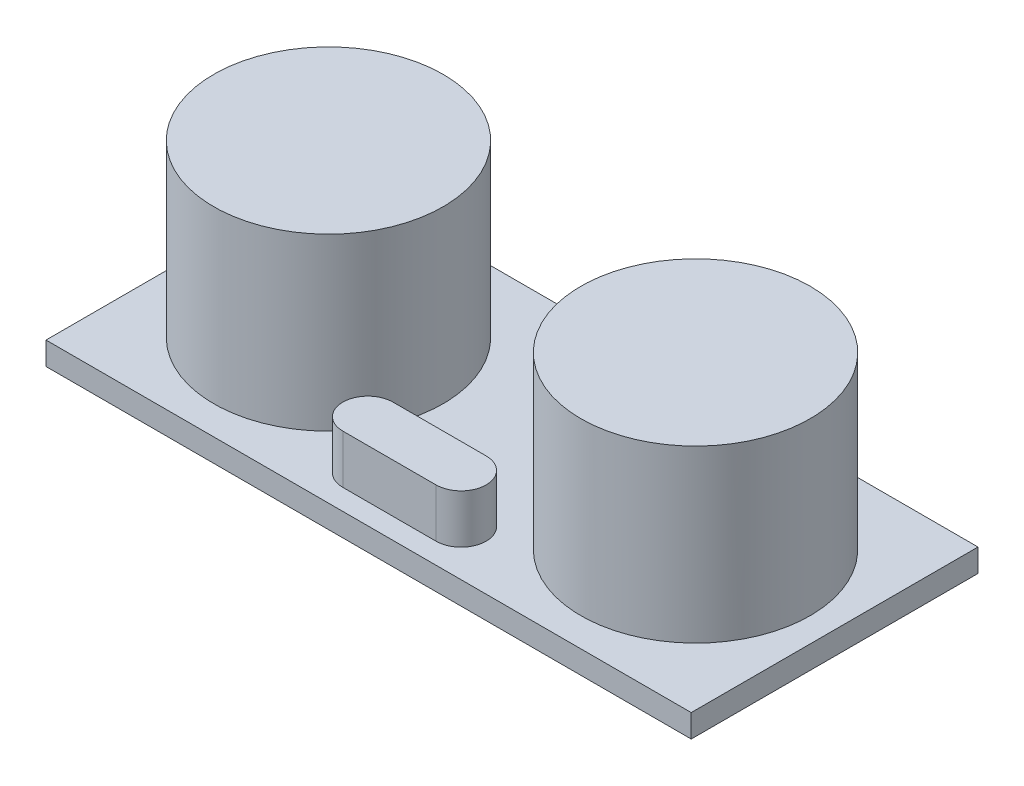
ISO-10303-21;
HEADER;
FILE_DESCRIPTION(('STEP AP214'),'2;1');
FILE_NAME('part.step','',(''),(''),'','','');
FILE_SCHEMA(('AUTOMOTIVE_DESIGN { 1 0 10303 214 1 1 1 1 }'));
ENDSEC;
DATA;
#1=APPLICATION_CONTEXT('core data for automotive mechanical design processes');
#2=APPLICATION_PROTOCOL_DEFINITION('international standard','automotive_design',2000,#1);
#3=PRODUCT_CONTEXT('',#1,'mechanical');
#4=PRODUCT('Part','Part','',(#3));
#5=PRODUCT_RELATED_PRODUCT_CATEGORY('part','',(#4));
#6=PRODUCT_DEFINITION_FORMATION('','',#4);
#7=PRODUCT_DEFINITION_CONTEXT('part definition',#1,'design');
#8=PRODUCT_DEFINITION('design','',#6,#7);
#9=PRODUCT_DEFINITION_SHAPE('','',#8);
#10=(LENGTH_UNIT() NAMED_UNIT(*) SI_UNIT(.MILLI.,.METRE.));
#11=(NAMED_UNIT(*) PLANE_ANGLE_UNIT() SI_UNIT($,.RADIAN.));
#12=(NAMED_UNIT(*) SI_UNIT($,.STERADIAN.) SOLID_ANGLE_UNIT());
#13=UNCERTAINTY_MEASURE_WITH_UNIT(LENGTH_MEASURE(1.E-05),#10,'distance_accuracy_value','');
#14=(GEOMETRIC_REPRESENTATION_CONTEXT(3) GLOBAL_UNCERTAINTY_ASSIGNED_CONTEXT((#13)) GLOBAL_UNIT_ASSIGNED_CONTEXT((#10,
#11,#12)) REPRESENTATION_CONTEXT('',''));
#15=CARTESIAN_POINT('',(0.,0.,0.));
#16=DIRECTION('',(0.,0.,1.));
#17=DIRECTION('',(1.,0.,0.));
#18=AXIS2_PLACEMENT_3D('',#15,#16,#17);
#19=CARTESIAN_POINT('',(0.,1.6,0.));
#20=DIRECTION('',(0.,-1.,0.));
#21=DIRECTION('',(0.,0.,-1.));
#22=AXIS2_PLACEMENT_3D('',#19,#20,#21);
#23=PLANE('',#22);
#24=DIRECTION('',(0.,0.,-1.));
#25=VECTOR('',#24,1.);
#26=CARTESIAN_POINT('',(22.5,1.6,10.));
#27=LINE('',#26,#25);
#28=CARTESIAN_POINT('',(22.5,1.6,10.));
#29=VERTEX_POINT('',#28);
#30=CARTESIAN_POINT('',(22.5,1.6,-10.));
#31=VERTEX_POINT('',#30);
#32=EDGE_CURVE('E214',#29,#31,#27,.T.);
#33=ORIENTED_EDGE('',*,*,#32,.T.);
#34=DIRECTION('',(-1.,0.,0.));
#35=VECTOR('',#34,1.);
#36=CARTESIAN_POINT('',(-22.5,1.6,-10.));
#37=LINE('',#36,#35);
#38=CARTESIAN_POINT('',(-22.5,1.6,-10.));
#39=VERTEX_POINT('',#38);
#40=EDGE_CURVE('E218',#31,#39,#37,.T.);
#41=ORIENTED_EDGE('',*,*,#40,.T.);
#42=DIRECTION('',(0.,0.,1.));
#43=VECTOR('',#42,1.);
#44=CARTESIAN_POINT('',(-22.5,1.6,10.));
#45=LINE('',#44,#43);
#46=CARTESIAN_POINT('',(-22.5,1.6,10.));
#47=VERTEX_POINT('',#46);
#48=EDGE_CURVE('E222',#39,#47,#45,.T.);
#49=ORIENTED_EDGE('',*,*,#48,.T.);
#50=DIRECTION('',(1.,0.,0.));
#51=VECTOR('',#50,1.);
#52=CARTESIAN_POINT('',(-22.5,1.6,10.));
#53=LINE('',#52,#51);
#54=EDGE_CURVE('E225',#47,#29,#53,.T.);
#55=ORIENTED_EDGE('',*,*,#54,.T.);
#56=EDGE_LOOP('',(#33,#41,#49,#55));
#57=FACE_BOUND('',#56,.T.);
#58=CARTESIAN_POINT('',(12.8,1.6,0.));
#59=DIRECTION('',(0.,-1.,0.));
#60=DIRECTION('',(0.,0.,-1.));
#61=AXIS2_PLACEMENT_3D('',#58,#59,#60);
#62=CIRCLE('',#61,8.);
#63=CARTESIAN_POINT('',(12.8,1.6,-8.00000000000001));
#64=VERTEX_POINT('',#63);
#65=EDGE_CURVE('E48',#64,#64,#62,.F.);
#66=ORIENTED_EDGE('',*,*,#65,.F.);
#67=EDGE_LOOP('',(#66));
#68=FACE_BOUND('',#67,.T.);
#69=CARTESIAN_POINT('',(-12.8,1.6,0.));
#70=DIRECTION('',(0.,-1.,0.));
#71=DIRECTION('',(0.,0.,-1.));
#72=AXIS2_PLACEMENT_3D('',#69,#70,#71);
#73=CIRCLE('',#72,8.);
#74=CARTESIAN_POINT('',(-12.8,1.6,-8.));
#75=VERTEX_POINT('',#74);
#76=EDGE_CURVE('E11',#75,#75,#73,.F.);
#77=ORIENTED_EDGE('',*,*,#76,.F.);
#78=EDGE_LOOP('',(#77));
#79=FACE_BOUND('',#78,.T.);
#80=CARTESIAN_POINT('',(-3.24999999999999,1.6,6.79875461617037));
#81=DIRECTION('',(0.,1.,0.));
#82=DIRECTION('',(0.,0.,1.));
#83=AXIS2_PLACEMENT_3D('',#80,#81,#82);
#84=CIRCLE('',#83,1.75);
#85=CARTESIAN_POINT('',(-3.24999999999999,1.6,5.04875461617037));
#86=VERTEX_POINT('',#85);
#87=CARTESIAN_POINT('',(-3.24999999999999,1.6,8.54875461617037));
#88=VERTEX_POINT('',#87);
#89=EDGE_CURVE('E154',#86,#88,#84,.T.);
#90=ORIENTED_EDGE('',*,*,#89,.F.);
#91=DIRECTION('',(-1.,0.,0.));
#92=VECTOR('',#91,1.);
#93=CARTESIAN_POINT('',(-3.24999999999999,1.6,5.04875461617037));
#94=LINE('',#93,#92);
#95=CARTESIAN_POINT('',(3.25000000000001,1.6,5.04875461617037));
#96=VERTEX_POINT('',#95);
#97=EDGE_CURVE('E170',#96,#86,#94,.T.);
#98=ORIENTED_EDGE('',*,*,#97,.F.);
#99=CARTESIAN_POINT('',(3.25,1.6,6.79875461617037));
#100=DIRECTION('',(0.,1.,0.));
#101=DIRECTION('',(0.,0.,1.));
#102=AXIS2_PLACEMENT_3D('',#99,#100,#101);
#103=CIRCLE('',#102,1.75);
#104=CARTESIAN_POINT('',(3.25,1.6,8.54875461617037));
#105=VERTEX_POINT('',#104);
#106=EDGE_CURVE('E183',#105,#96,#103,.T.);
#107=ORIENTED_EDGE('',*,*,#106,.F.);
#108=DIRECTION('',(1.,0.,0.));
#109=VECTOR('',#108,1.);
#110=CARTESIAN_POINT('',(-3.24999999999999,1.6,8.54875461617037));
#111=LINE('',#110,#109);
#112=EDGE_CURVE('E159',#88,#105,#111,.T.);
#113=ORIENTED_EDGE('',*,*,#112,.F.);
#114=EDGE_LOOP('',(#90,#98,#107,#113));
#115=FACE_BOUND('',#114,.T.);
#116=ADVANCED_FACE('F39',(#57,#68,#79,#115),#23,.F.);
#117=CARTESIAN_POINT('',(22.5,1.6,10.));
#118=DIRECTION('',(-1.,0.,0.));
#119=DIRECTION('',(0.,0.,1.));
#120=AXIS2_PLACEMENT_3D('',#117,#118,#119);
#121=PLANE('',#120);
#122=DIRECTION('',(0.,0.,-1.));
#123=VECTOR('',#122,1.);
#124=CARTESIAN_POINT('',(22.5,0.,10.));
#125=LINE('',#124,#123);
#126=CARTESIAN_POINT('',(22.5,0.,10.));
#127=VERTEX_POINT('',#126);
#128=CARTESIAN_POINT('',(22.5,0.,-10.));
#129=VERTEX_POINT('',#128);
#130=EDGE_CURVE('E213',#127,#129,#125,.T.);
#131=ORIENTED_EDGE('',*,*,#130,.T.);
#132=DIRECTION('',(0.,-1.,0.));
#133=VECTOR('',#132,1.);
#134=CARTESIAN_POINT('',(22.5,1.6,-10.));
#135=LINE('',#134,#133);
#136=EDGE_CURVE('E252',#31,#129,#135,.T.);
#137=ORIENTED_EDGE('',*,*,#136,.F.);
#138=ORIENTED_EDGE('',*,*,#32,.F.);
#139=DIRECTION('',(0.,-1.,0.));
#140=VECTOR('',#139,1.);
#141=CARTESIAN_POINT('',(22.5,1.6,10.));
#142=LINE('',#141,#140);
#143=EDGE_CURVE('E228',#29,#127,#142,.T.);
#144=ORIENTED_EDGE('',*,*,#143,.T.);
#145=EDGE_LOOP('',(#131,#137,#138,#144));
#146=FACE_BOUND('',#145,.T.);
#147=ADVANCED_FACE('F41',(#146),#121,.F.);
#148=CARTESIAN_POINT('',(-22.5,1.6,-10.));
#149=DIRECTION('',(0.,0.,1.));
#150=DIRECTION('',(1.,0.,0.));
#151=AXIS2_PLACEMENT_3D('',#148,#149,#150);
#152=PLANE('',#151);
#153=DIRECTION('',(-1.,0.,0.));
#154=VECTOR('',#153,1.);
#155=CARTESIAN_POINT('',(-22.5,0.,-10.));
#156=LINE('',#155,#154);
#157=CARTESIAN_POINT('',(5.,0.,-10.));
#158=VERTEX_POINT('',#157);
#159=EDGE_CURVE('E232',#129,#158,#156,.T.);
#160=ORIENTED_EDGE('',*,*,#159,.T.);
#161=DIRECTION('',(0.,1.,0.));
#162=VECTOR('',#161,1.);
#163=CARTESIAN_POINT('',(5.,-10.,-10.));
#164=LINE('',#163,#162);
#165=CARTESIAN_POINT('',(5.,-10.,-10.));
#166=VERTEX_POINT('',#165);
#167=EDGE_CURVE('E326',#166,#158,#164,.T.);
#168=ORIENTED_EDGE('',*,*,#167,.F.);
#169=DIRECTION('',(1.,0.,0.));
#170=VECTOR('',#169,1.);
#171=CARTESIAN_POINT('',(-5.,-10.,-10.));
#172=LINE('',#171,#170);
#173=CARTESIAN_POINT('',(-5.,-10.,-10.));
#174=VERTEX_POINT('',#173);
#175=EDGE_CURVE('E144',#174,#166,#172,.T.);
#176=ORIENTED_EDGE('',*,*,#175,.F.);
#177=DIRECTION('',(0.,1.,0.));
#178=VECTOR('',#177,1.);
#179=CARTESIAN_POINT('',(-5.,-10.,-10.));
#180=LINE('',#179,#178);
#181=CARTESIAN_POINT('',(-5.,0.,-10.));
#182=VERTEX_POINT('',#181);
#183=EDGE_CURVE('E161',#174,#182,#180,.T.);
#184=ORIENTED_EDGE('',*,*,#183,.T.);
#185=CARTESIAN_POINT('',(-22.5,0.,-10.));
#186=VERTEX_POINT('',#185);
#187=EDGE_CURVE('E61',#182,#186,#156,.T.);
#188=ORIENTED_EDGE('',*,*,#187,.T.);
#189=DIRECTION('',(0.,-1.,0.));
#190=VECTOR('',#189,1.);
#191=CARTESIAN_POINT('',(-22.5,1.6,-10.));
#192=LINE('',#191,#190);
#193=EDGE_CURVE('E248',#39,#186,#192,.T.);
#194=ORIENTED_EDGE('',*,*,#193,.F.);
#195=ORIENTED_EDGE('',*,*,#40,.F.);
#196=ORIENTED_EDGE('',*,*,#136,.T.);
#197=EDGE_LOOP('',(#160,#168,#176,#184,#188,#194,#195,#196));
#198=FACE_BOUND('',#197,.T.);
#199=ADVANCED_FACE('F318',(#198),#152,.F.);
#200=CARTESIAN_POINT('',(-22.5,1.6,10.));
#201=DIRECTION('',(1.,0.,0.));
#202=DIRECTION('',(0.,0.,-1.));
#203=AXIS2_PLACEMENT_3D('',#200,#201,#202);
#204=PLANE('',#203);
#205=DIRECTION('',(0.,0.,1.));
#206=VECTOR('',#205,1.);
#207=CARTESIAN_POINT('',(-22.5,0.,10.));
#208=LINE('',#207,#206);
#209=CARTESIAN_POINT('',(-22.5,0.,10.));
#210=VERTEX_POINT('',#209);
#211=EDGE_CURVE('E236',#186,#210,#208,.T.);
#212=ORIENTED_EDGE('',*,*,#211,.T.);
#213=DIRECTION('',(0.,-1.,0.));
#214=VECTOR('',#213,1.);
#215=CARTESIAN_POINT('',(-22.5,1.6,10.));
#216=LINE('',#215,#214);
#217=EDGE_CURVE('E244',#47,#210,#216,.T.);
#218=ORIENTED_EDGE('',*,*,#217,.F.);
#219=ORIENTED_EDGE('',*,*,#48,.F.);
#220=ORIENTED_EDGE('',*,*,#193,.T.);
#221=EDGE_LOOP('',(#212,#218,#219,#220));
#222=FACE_BOUND('',#221,.T.);
#223=ADVANCED_FACE('F315',(#222),#204,.F.);
#224=CARTESIAN_POINT('',(-22.5,1.6,10.));
#225=DIRECTION('',(0.,0.,-1.));
#226=DIRECTION('',(-1.,0.,0.));
#227=AXIS2_PLACEMENT_3D('',#224,#225,#226);
#228=PLANE('',#227);
#229=DIRECTION('',(1.,0.,0.));
#230=VECTOR('',#229,1.);
#231=CARTESIAN_POINT('',(-22.5,0.,10.));
#232=LINE('',#231,#230);
#233=EDGE_CURVE('E219',#210,#127,#232,.T.);
#234=ORIENTED_EDGE('',*,*,#233,.T.);
#235=ORIENTED_EDGE('',*,*,#143,.F.);
#236=ORIENTED_EDGE('',*,*,#54,.F.);
#237=ORIENTED_EDGE('',*,*,#217,.T.);
#238=EDGE_LOOP('',(#234,#235,#236,#237));
#239=FACE_BOUND('',#238,.T.);
#240=ADVANCED_FACE('F312',(#239),#228,.F.);
#241=CARTESIAN_POINT('',(0.,0.,0.));
#242=DIRECTION('',(0.,-1.,0.));
#243=DIRECTION('',(0.,0.,-1.));
#244=AXIS2_PLACEMENT_3D('',#241,#242,#243);
#245=PLANE('',#244);
#246=DIRECTION('',(0.,0.,1.));
#247=VECTOR('',#246,1.);
#248=CARTESIAN_POINT('',(5.,0.,-7.5));
#249=LINE('',#248,#247);
#250=CARTESIAN_POINT('',(5.,0.,-7.5));
#251=VERTEX_POINT('',#250);
#252=EDGE_CURVE('E152',#158,#251,#249,.T.);
#253=ORIENTED_EDGE('',*,*,#252,.F.);
#254=ORIENTED_EDGE('',*,*,#159,.F.);
#255=ORIENTED_EDGE('',*,*,#130,.F.);
#256=ORIENTED_EDGE('',*,*,#233,.F.);
#257=ORIENTED_EDGE('',*,*,#211,.F.);
#258=ORIENTED_EDGE('',*,*,#187,.F.);
#259=DIRECTION('',(0.,0.,-1.));
#260=VECTOR('',#259,1.);
#261=CARTESIAN_POINT('',(-5.,0.,-7.5));
#262=LINE('',#261,#260);
#263=CARTESIAN_POINT('',(-5.,0.,-7.5));
#264=VERTEX_POINT('',#263);
#265=EDGE_CURVE('E149',#264,#182,#262,.T.);
#266=ORIENTED_EDGE('',*,*,#265,.F.);
#267=DIRECTION('',(-1.,0.,0.));
#268=VECTOR('',#267,1.);
#269=CARTESIAN_POINT('',(-5.,0.,-7.5));
#270=LINE('',#269,#268);
#271=EDGE_CURVE('E55',#251,#264,#270,.T.);
#272=ORIENTED_EDGE('',*,*,#271,.F.);
#273=EDGE_LOOP('',(#253,#254,#255,#256,#257,#258,#266,#272));
#274=FACE_BOUND('',#273,.T.);
#275=ADVANCED_FACE('F307',(#274),#245,.T.);
#276=CARTESIAN_POINT('',(12.8,13.5,0.));
#277=DIRECTION('',(0.,-1.,0.));
#278=DIRECTION('',(0.,0.,-1.));
#279=AXIS2_PLACEMENT_3D('',#276,#277,#278);
#280=CYLINDRICAL_SURFACE('',#279,8.);
#281=CARTESIAN_POINT('',(12.8,13.5,0.));
#282=DIRECTION('',(0.,1.,0.));
#283=DIRECTION('',(0.,0.,1.));
#284=AXIS2_PLACEMENT_3D('',#281,#282,#283);
#285=CIRCLE('',#284,8.);
#286=CARTESIAN_POINT('',(12.8,13.5,7.99999999999999));
#287=VERTEX_POINT('',#286);
#288=EDGE_CURVE('E209',#287,#287,#285,.T.);
#289=ORIENTED_EDGE('',*,*,#288,.F.);
#290=EDGE_LOOP('',(#289));
#291=FACE_BOUND('',#290,.T.);
#292=ORIENTED_EDGE('',*,*,#65,.T.);
#293=EDGE_LOOP('',(#292));
#294=FACE_BOUND('',#293,.T.);
#295=ADVANCED_FACE('F259',(#291,#294),#280,.T.);
#296=CARTESIAN_POINT('',(12.8,13.5,0.));
#297=DIRECTION('',(0.,1.,0.));
#298=DIRECTION('',(0.,0.,1.));
#299=AXIS2_PLACEMENT_3D('',#296,#297,#298);
#300=PLANE('',#299);
#301=ORIENTED_EDGE('',*,*,#288,.T.);
#302=EDGE_LOOP('',(#301));
#303=FACE_BOUND('',#302,.T.);
#304=ADVANCED_FACE('F301',(#303),#300,.T.);
#305=CARTESIAN_POINT('',(-12.8,13.5,0.));
#306=DIRECTION('',(0.,-1.,0.));
#307=DIRECTION('',(0.,0.,-1.));
#308=AXIS2_PLACEMENT_3D('',#305,#306,#307);
#309=CYLINDRICAL_SURFACE('',#308,8.);
#310=CARTESIAN_POINT('',(-12.8,13.5,0.));
#311=DIRECTION('',(0.,1.,0.));
#312=DIRECTION('',(0.,0.,-1.));
#313=AXIS2_PLACEMENT_3D('',#310,#311,#312);
#314=CIRCLE('',#313,8.);
#315=CARTESIAN_POINT('',(-12.8,13.5,-8.));
#316=VERTEX_POINT('',#315);
#317=EDGE_CURVE('E205',#316,#316,#314,.T.);
#318=ORIENTED_EDGE('',*,*,#317,.F.);
#319=EDGE_LOOP('',(#318));
#320=FACE_BOUND('',#319,.T.);
#321=ORIENTED_EDGE('',*,*,#76,.T.);
#322=EDGE_LOOP('',(#321));
#323=FACE_BOUND('',#322,.T.);
#324=ADVANCED_FACE('F297',(#320,#323),#309,.T.);
#325=CARTESIAN_POINT('',(-12.8,13.5,0.));
#326=DIRECTION('',(0.,-1.,0.));
#327=DIRECTION('',(0.,0.,-1.));
#328=AXIS2_PLACEMENT_3D('',#325,#326,#327);
#329=PLANE('',#328);
#330=ORIENTED_EDGE('',*,*,#317,.T.);
#331=EDGE_LOOP('',(#330));
#332=FACE_BOUND('',#331,.T.);
#333=ADVANCED_FACE('F291',(#332),#329,.F.);
#334=CARTESIAN_POINT('',(-3.24999999999999,5.,6.79875461617037));
#335=DIRECTION('',(0.,-1.,0.));
#336=DIRECTION('',(0.,0.,-1.));
#337=AXIS2_PLACEMENT_3D('',#334,#335,#336);
#338=CYLINDRICAL_SURFACE('',#337,1.75);
#339=ORIENTED_EDGE('',*,*,#89,.T.);
#340=DIRECTION('',(0.,-1.,0.));
#341=VECTOR('',#340,1.);
#342=CARTESIAN_POINT('',(-3.24999999999999,5.,8.54875461617037));
#343=LINE('',#342,#341);
#344=CARTESIAN_POINT('',(-3.24999999999999,5.,8.54875461617037));
#345=VERTEX_POINT('',#344);
#346=EDGE_CURVE('E201',#345,#88,#343,.T.);
#347=ORIENTED_EDGE('',*,*,#346,.F.);
#348=CARTESIAN_POINT('',(-3.24999999999999,5.,6.79875461617037));
#349=DIRECTION('',(0.,1.,0.));
#350=DIRECTION('',(0.,0.,1.));
#351=AXIS2_PLACEMENT_3D('',#348,#349,#350);
#352=CIRCLE('',#351,1.75);
#353=CARTESIAN_POINT('',(-3.24999999999999,5.,5.04875461617037));
#354=VERTEX_POINT('',#353);
#355=EDGE_CURVE('E165',#354,#345,#352,.T.);
#356=ORIENTED_EDGE('',*,*,#355,.F.);
#357=DIRECTION('',(0.,-1.,0.));
#358=VECTOR('',#357,1.);
#359=CARTESIAN_POINT('',(-3.24999999999999,5.,5.04875461617037));
#360=LINE('',#359,#358);
#361=EDGE_CURVE('E178',#354,#86,#360,.T.);
#362=ORIENTED_EDGE('',*,*,#361,.T.);
#363=EDGE_LOOP('',(#339,#347,#356,#362));
#364=FACE_BOUND('',#363,.T.);
#365=ADVANCED_FACE('F275',(#364),#338,.T.);
#366=CARTESIAN_POINT('',(-3.24999999999999,5.,8.54875461617037));
#367=DIRECTION('',(0.,0.,-1.));
#368=DIRECTION('',(-1.,0.,0.));
#369=AXIS2_PLACEMENT_3D('',#366,#367,#368);
#370=PLANE('',#369);
#371=ORIENTED_EDGE('',*,*,#112,.T.);
#372=DIRECTION('',(0.,-1.,0.));
#373=VECTOR('',#372,1.);
#374=CARTESIAN_POINT('',(3.25,5.,8.54875461617037));
#375=LINE('',#374,#373);
#376=CARTESIAN_POINT('',(3.25,5.,8.54875461617037));
#377=VERTEX_POINT('',#376);
#378=EDGE_CURVE('E197',#377,#105,#375,.T.);
#379=ORIENTED_EDGE('',*,*,#378,.F.);
#380=DIRECTION('',(1.,0.,0.));
#381=VECTOR('',#380,1.);
#382=CARTESIAN_POINT('',(-3.24999999999999,5.,8.54875461617037));
#383=LINE('',#382,#381);
#384=EDGE_CURVE('E169',#345,#377,#383,.T.);
#385=ORIENTED_EDGE('',*,*,#384,.F.);
#386=ORIENTED_EDGE('',*,*,#346,.T.);
#387=EDGE_LOOP('',(#371,#379,#385,#386));
#388=FACE_BOUND('',#387,.T.);
#389=ADVANCED_FACE('F283',(#388),#370,.F.);
#390=CARTESIAN_POINT('',(3.25,5.,6.79875461617037));
#391=DIRECTION('',(0.,-1.,0.));
#392=DIRECTION('',(0.,0.,-1.));
#393=AXIS2_PLACEMENT_3D('',#390,#391,#392);
#394=CYLINDRICAL_SURFACE('',#393,1.75);
#395=ORIENTED_EDGE('',*,*,#106,.T.);
#396=DIRECTION('',(0.,-1.,0.));
#397=VECTOR('',#396,1.);
#398=CARTESIAN_POINT('',(3.25000000000001,5.,5.04875461617037));
#399=LINE('',#398,#397);
#400=CARTESIAN_POINT('',(3.25000000000001,5.,5.04875461617037));
#401=VERTEX_POINT('',#400);
#402=EDGE_CURVE('E193',#401,#96,#399,.T.);
#403=ORIENTED_EDGE('',*,*,#402,.F.);
#404=CARTESIAN_POINT('',(3.25,5.,6.79875461617037));
#405=DIRECTION('',(0.,1.,0.));
#406=DIRECTION('',(0.,0.,1.));
#407=AXIS2_PLACEMENT_3D('',#404,#405,#406);
#408=CIRCLE('',#407,1.75);
#409=EDGE_CURVE('E173',#377,#401,#408,.T.);
#410=ORIENTED_EDGE('',*,*,#409,.F.);
#411=ORIENTED_EDGE('',*,*,#378,.T.);
#412=EDGE_LOOP('',(#395,#403,#410,#411));
#413=FACE_BOUND('',#412,.T.);
#414=ADVANCED_FACE('F281',(#413),#394,.T.);
#415=CARTESIAN_POINT('',(-3.24999999999999,5.,5.04875461617037));
#416=DIRECTION('',(0.,0.,1.));
#417=DIRECTION('',(1.,0.,0.));
#418=AXIS2_PLACEMENT_3D('',#415,#416,#417);
#419=PLANE('',#418);
#420=ORIENTED_EDGE('',*,*,#97,.T.);
#421=ORIENTED_EDGE('',*,*,#361,.F.);
#422=DIRECTION('',(-1.,0.,0.));
#423=VECTOR('',#422,1.);
#424=CARTESIAN_POINT('',(-3.24999999999999,5.,5.04875461617037));
#425=LINE('',#424,#423);
#426=EDGE_CURVE('E176',#401,#354,#425,.T.);
#427=ORIENTED_EDGE('',*,*,#426,.F.);
#428=ORIENTED_EDGE('',*,*,#402,.T.);
#429=EDGE_LOOP('',(#420,#421,#427,#428));
#430=FACE_BOUND('',#429,.T.);
#431=ADVANCED_FACE('F271',(#430),#419,.F.);
#432=CARTESIAN_POINT('',(-3.24999999999999,5.,6.79875461617037));
#433=DIRECTION('',(0.,1.,0.));
#434=DIRECTION('',(0.,0.,1.));
#435=AXIS2_PLACEMENT_3D('',#432,#433,#434);
#436=PLANE('',#435);
#437=ORIENTED_EDGE('',*,*,#355,.T.);
#438=ORIENTED_EDGE('',*,*,#384,.T.);
#439=ORIENTED_EDGE('',*,*,#409,.T.);
#440=ORIENTED_EDGE('',*,*,#426,.T.);
#441=EDGE_LOOP('',(#437,#438,#439,#440));
#442=FACE_BOUND('',#441,.T.);
#443=ADVANCED_FACE('F277',(#442),#436,.T.);
#444=CARTESIAN_POINT('',(5.,-10.,-7.5));
#445=DIRECTION('',(-1.,0.,0.));
#446=DIRECTION('',(0.,0.,1.));
#447=AXIS2_PLACEMENT_3D('',#444,#445,#446);
#448=PLANE('',#447);
#449=ORIENTED_EDGE('',*,*,#252,.T.);
#450=DIRECTION('',(0.,1.,0.));
#451=VECTOR('',#450,1.);
#452=CARTESIAN_POINT('',(5.,-10.,-7.5));
#453=LINE('',#452,#451);
#454=CARTESIAN_POINT('',(5.,-10.,-7.5));
#455=VERTEX_POINT('',#454);
#456=EDGE_CURVE('E131',#455,#251,#453,.T.);
#457=ORIENTED_EDGE('',*,*,#456,.F.);
#458=DIRECTION('',(0.,0.,1.));
#459=VECTOR('',#458,1.);
#460=CARTESIAN_POINT('',(5.,-10.,-7.5));
#461=LINE('',#460,#459);
#462=EDGE_CURVE('E139',#166,#455,#461,.T.);
#463=ORIENTED_EDGE('',*,*,#462,.F.);
#464=ORIENTED_EDGE('',*,*,#167,.T.);
#465=EDGE_LOOP('',(#449,#457,#463,#464));
#466=FACE_BOUND('',#465,.T.);
#467=ADVANCED_FACE('F151',(#466),#448,.F.);
#468=CARTESIAN_POINT('',(-5.,-10.,-7.5));
#469=DIRECTION('',(0.,0.,-1.));
#470=DIRECTION('',(-1.,0.,0.));
#471=AXIS2_PLACEMENT_3D('',#468,#469,#470);
#472=PLANE('',#471);
#473=ORIENTED_EDGE('',*,*,#271,.T.);
#474=DIRECTION('',(0.,1.,0.));
#475=VECTOR('',#474,1.);
#476=CARTESIAN_POINT('',(-5.,-10.,-7.5));
#477=LINE('',#476,#475);
#478=CARTESIAN_POINT('',(-5.,-10.,-7.5));
#479=VERTEX_POINT('',#478);
#480=EDGE_CURVE('E134',#479,#264,#477,.T.);
#481=ORIENTED_EDGE('',*,*,#480,.F.);
#482=DIRECTION('',(-1.,0.,0.));
#483=VECTOR('',#482,1.);
#484=CARTESIAN_POINT('',(-5.,-10.,-7.5));
#485=LINE('',#484,#483);
#486=EDGE_CURVE('E127',#455,#479,#485,.T.);
#487=ORIENTED_EDGE('',*,*,#486,.F.);
#488=ORIENTED_EDGE('',*,*,#456,.T.);
#489=EDGE_LOOP('',(#473,#481,#487,#488));
#490=FACE_BOUND('',#489,.T.);
#491=ADVANCED_FACE('F129',(#490),#472,.F.);
#492=CARTESIAN_POINT('',(-5.,-10.,-7.5));
#493=DIRECTION('',(1.,0.,0.));
#494=DIRECTION('',(0.,0.,-1.));
#495=AXIS2_PLACEMENT_3D('',#492,#493,#494);
#496=PLANE('',#495);
#497=ORIENTED_EDGE('',*,*,#265,.T.);
#498=ORIENTED_EDGE('',*,*,#183,.F.);
#499=DIRECTION('',(0.,0.,-1.));
#500=VECTOR('',#499,1.);
#501=CARTESIAN_POINT('',(-5.,-10.,-7.5));
#502=LINE('',#501,#500);
#503=EDGE_CURVE('E138',#479,#174,#502,.T.);
#504=ORIENTED_EDGE('',*,*,#503,.F.);
#505=ORIENTED_EDGE('',*,*,#480,.T.);
#506=EDGE_LOOP('',(#497,#498,#504,#505));
#507=FACE_BOUND('',#506,.T.);
#508=ADVANCED_FACE('F345',(#507),#496,.F.);
#509=CARTESIAN_POINT('',(0.,-10.,0.));
#510=DIRECTION('',(0.,-1.,0.));
#511=DIRECTION('',(0.,0.,-1.));
#512=AXIS2_PLACEMENT_3D('',#509,#510,#511);
#513=PLANE('',#512);
#514=ORIENTED_EDGE('',*,*,#462,.T.);
#515=ORIENTED_EDGE('',*,*,#486,.T.);
#516=ORIENTED_EDGE('',*,*,#503,.T.);
#517=ORIENTED_EDGE('',*,*,#175,.T.);
#518=EDGE_LOOP('',(#514,#515,#516,#517));
#519=FACE_BOUND('',#518,.T.);
#520=ADVANCED_FACE('F142',(#519),#513,.T.);
#521=CLOSED_SHELL('',(#116,#147,#199,#223,#240,#275,#295,#304,#324,#333,#365,#389,#414,#431,
#443,#467,#491,#508,#520));
#522=MANIFOLD_SOLID_BREP('B2',#521);
#523=ADVANCED_BREP_SHAPE_REPRESENTATION('',(#18,#522),#14);
#524=SHAPE_DEFINITION_REPRESENTATION(#9,#523);
ENDSEC;
END-ISO-10303-21;
